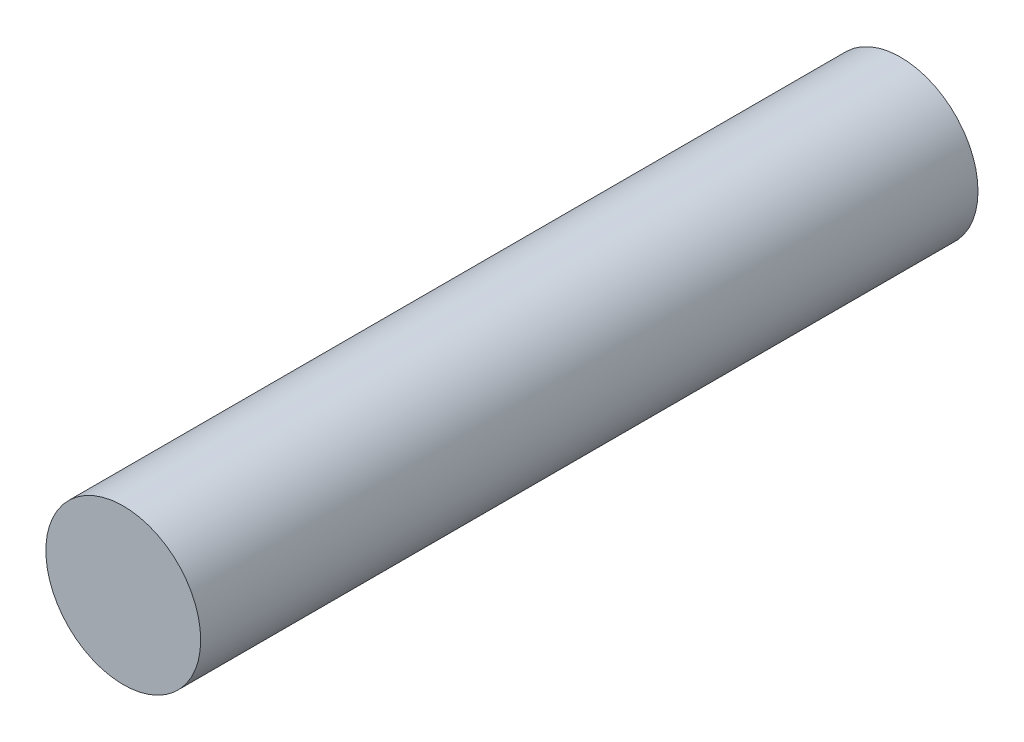
ISO-10303-21;
HEADER;
FILE_DESCRIPTION(('STEP AP214'),'2;1');
FILE_NAME('part.step','',(''),(''),'','','');
FILE_SCHEMA(('AUTOMOTIVE_DESIGN { 1 0 10303 214 1 1 1 1 }'));
ENDSEC;
DATA;
#1=APPLICATION_CONTEXT('core data for automotive mechanical design processes');
#2=APPLICATION_PROTOCOL_DEFINITION('international standard','automotive_design',2000,#1);
#3=PRODUCT_CONTEXT('',#1,'mechanical');
#4=PRODUCT('Part','Part','',(#3));
#5=PRODUCT_RELATED_PRODUCT_CATEGORY('part','',(#4));
#6=PRODUCT_DEFINITION_FORMATION('','',#4);
#7=PRODUCT_DEFINITION_CONTEXT('part definition',#1,'design');
#8=PRODUCT_DEFINITION('design','',#6,#7);
#9=PRODUCT_DEFINITION_SHAPE('','',#8);
#10=(LENGTH_UNIT() NAMED_UNIT(*) SI_UNIT(.MILLI.,.METRE.));
#11=(NAMED_UNIT(*) PLANE_ANGLE_UNIT() SI_UNIT($,.RADIAN.));
#12=(NAMED_UNIT(*) SI_UNIT($,.STERADIAN.) SOLID_ANGLE_UNIT());
#13=UNCERTAINTY_MEASURE_WITH_UNIT(LENGTH_MEASURE(1.E-05),#10,'distance_accuracy_value','');
#14=(GEOMETRIC_REPRESENTATION_CONTEXT(3) GLOBAL_UNCERTAINTY_ASSIGNED_CONTEXT((#13)) GLOBAL_UNIT_ASSIGNED_CONTEXT((#10,
#11,#12)) REPRESENTATION_CONTEXT('',''));
#15=CARTESIAN_POINT('',(0.,0.,0.));
#16=DIRECTION('',(0.,0.,1.));
#17=DIRECTION('',(1.,0.,0.));
#18=AXIS2_PLACEMENT_3D('',#15,#16,#17);
#19=CARTESIAN_POINT('',(0.,0.,-10.));
#20=DIRECTION('',(0.,0.,1.));
#21=DIRECTION('',(1.,0.,0.));
#22=AXIS2_PLACEMENT_3D('',#19,#20,#21);
#23=CYLINDRICAL_SURFACE('',#22,2.49);
#24=CARTESIAN_POINT('',(0.,0.,-10.));
#25=DIRECTION('',(0.,0.,1.));
#26=DIRECTION('',(1.,0.,0.));
#27=AXIS2_PLACEMENT_3D('',#24,#25,#26);
#28=CIRCLE('',#27,2.49);
#29=CARTESIAN_POINT('',(2.49,0.,-10.));
#30=VERTEX_POINT('',#29);
#31=EDGE_CURVE('E10',#30,#30,#28,.T.);
#32=ORIENTED_EDGE('',*,*,#31,.T.);
#33=EDGE_LOOP('',(#32));
#34=FACE_BOUND('',#33,.T.);
#35=CARTESIAN_POINT('',(0.,0.,15.));
#36=DIRECTION('',(0.,0.,1.));
#37=DIRECTION('',(1.,0.,0.));
#38=AXIS2_PLACEMENT_3D('',#35,#36,#37);
#39=CIRCLE('',#38,2.49);
#40=CARTESIAN_POINT('',(2.49,0.,15.));
#41=VERTEX_POINT('',#40);
#42=EDGE_CURVE('E41',#41,#41,#39,.T.);
#43=ORIENTED_EDGE('',*,*,#42,.F.);
#44=EDGE_LOOP('',(#43));
#45=FACE_BOUND('',#44,.T.);
#46=ADVANCED_FACE('F35',(#34,#45),#23,.T.);
#47=CARTESIAN_POINT('',(0.,0.,-10.));
#48=DIRECTION('',(0.,0.,1.));
#49=DIRECTION('',(1.,0.,0.));
#50=AXIS2_PLACEMENT_3D('',#47,#48,#49);
#51=PLANE('',#50);
#52=ORIENTED_EDGE('',*,*,#31,.F.);
#53=EDGE_LOOP('',(#52));
#54=FACE_BOUND('',#53,.T.);
#55=ADVANCED_FACE('F50',(#54),#51,.F.);
#56=CARTESIAN_POINT('',(0.,0.,15.));
#57=DIRECTION('',(0.,0.,1.));
#58=DIRECTION('',(1.,0.,0.));
#59=AXIS2_PLACEMENT_3D('',#56,#57,#58);
#60=PLANE('',#59);
#61=ORIENTED_EDGE('',*,*,#42,.T.);
#62=EDGE_LOOP('',(#61));
#63=FACE_BOUND('',#62,.T.);
#64=ADVANCED_FACE('F47',(#63),#60,.T.);
#65=CLOSED_SHELL('',(#46,#55,#64));
#66=MANIFOLD_SOLID_BREP('B2',#65);
#67=ADVANCED_BREP_SHAPE_REPRESENTATION('',(#18,#66),#14);
#68=SHAPE_DEFINITION_REPRESENTATION(#9,#67);
ENDSEC;
END-ISO-10303-21;
